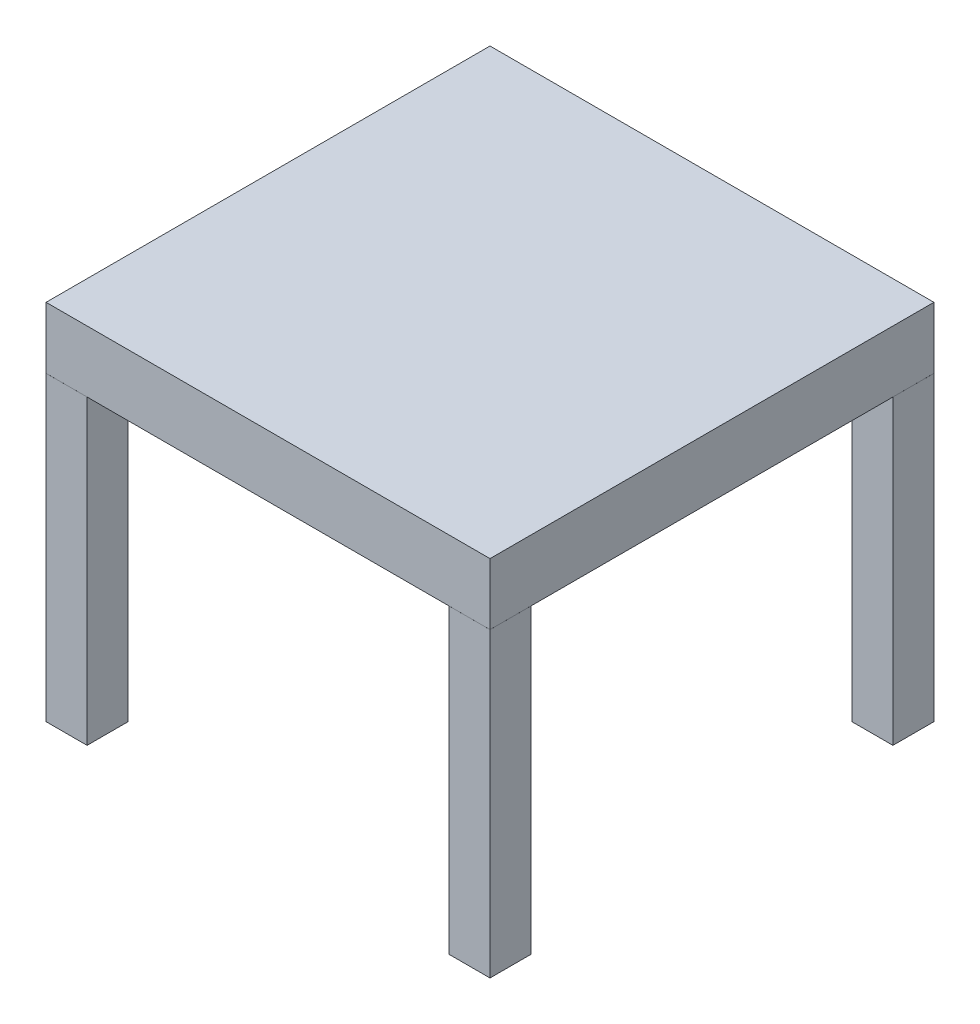
ISO-10303-21;
HEADER;
FILE_DESCRIPTION(('STEP AP214'),'2;1');
FILE_NAME('part.step','',(''),(''),'','','');
FILE_SCHEMA(('AUTOMOTIVE_DESIGN { 1 0 10303 214 1 1 1 1 }'));
ENDSEC;
DATA;
#1=APPLICATION_CONTEXT('core data for automotive mechanical design processes');
#2=APPLICATION_PROTOCOL_DEFINITION('international standard','automotive_design',2000,#1);
#3=PRODUCT_CONTEXT('',#1,'mechanical');
#4=PRODUCT('Part','Part','',(#3));
#5=PRODUCT_RELATED_PRODUCT_CATEGORY('part','',(#4));
#6=PRODUCT_DEFINITION_FORMATION('','',#4);
#7=PRODUCT_DEFINITION_CONTEXT('part definition',#1,'design');
#8=PRODUCT_DEFINITION('design','',#6,#7);
#9=PRODUCT_DEFINITION_SHAPE('','',#8);
#10=(LENGTH_UNIT() NAMED_UNIT(*) SI_UNIT(.MILLI.,.METRE.));
#11=(NAMED_UNIT(*) PLANE_ANGLE_UNIT() SI_UNIT($,.RADIAN.));
#12=(NAMED_UNIT(*) SI_UNIT($,.STERADIAN.) SOLID_ANGLE_UNIT());
#13=UNCERTAINTY_MEASURE_WITH_UNIT(LENGTH_MEASURE(1.E-05),#10,'distance_accuracy_value','');
#14=(GEOMETRIC_REPRESENTATION_CONTEXT(3) GLOBAL_UNCERTAINTY_ASSIGNED_CONTEXT((#13)) GLOBAL_UNIT_ASSIGNED_CONTEXT((#10,
#11,#12)) REPRESENTATION_CONTEXT('',''));
#15=CARTESIAN_POINT('',(0.,0.,0.));
#16=DIRECTION('',(0.,0.,1.));
#17=DIRECTION('',(1.,0.,0.));
#18=AXIS2_PLACEMENT_3D('',#15,#16,#17);
#19=CARTESIAN_POINT('',(-275.,38.1,-275.));
#20=DIRECTION('',(1.,0.,0.));
#21=DIRECTION('',(0.,0.,-1.));
#22=AXIS2_PLACEMENT_3D('',#19,#20,#21);
#23=PLANE('',#22);
#24=DIRECTION('',(0.,-1.,0.));
#25=VECTOR('',#24,1.);
#26=CARTESIAN_POINT('',(-275.,38.1,-275.));
#27=LINE('',#26,#25);
#28=CARTESIAN_POINT('',(-275.,38.1,-275.));
#29=VERTEX_POINT('',#28);
#30=CARTESIAN_POINT('',(-275.,-38.1,-275.));
#31=VERTEX_POINT('',#30);
#32=EDGE_CURVE('E115',#29,#31,#27,.T.);
#33=ORIENTED_EDGE('',*,*,#32,.T.);
#34=DIRECTION('',(0.,0.,1.));
#35=VECTOR('',#34,1.);
#36=CARTESIAN_POINT('',(-275.,-38.1,295.148496587345));
#37=LINE('',#36,#35);
#38=CARTESIAN_POINT('',(-275.,-38.1,275.));
#39=VERTEX_POINT('',#38);
#40=EDGE_CURVE('E85',#31,#39,#37,.T.);
#41=ORIENTED_EDGE('',*,*,#40,.T.);
#42=DIRECTION('',(0.,-1.,0.));
#43=VECTOR('',#42,1.);
#44=CARTESIAN_POINT('',(-275.,38.1,275.));
#45=LINE('',#44,#43);
#46=CARTESIAN_POINT('',(-275.,38.1,275.));
#47=VERTEX_POINT('',#46);
#48=EDGE_CURVE('E55',#47,#39,#45,.T.);
#49=ORIENTED_EDGE('',*,*,#48,.F.);
#50=DIRECTION('',(0.,0.,1.));
#51=VECTOR('',#50,1.);
#52=CARTESIAN_POINT('',(-275.,38.1,-275.));
#53=LINE('',#52,#51);
#54=EDGE_CURVE('E104',#29,#47,#53,.T.);
#55=ORIENTED_EDGE('',*,*,#54,.F.);
#56=EDGE_LOOP('',(#33,#41,#49,#55));
#57=FACE_BOUND('',#56,.T.);
#58=ADVANCED_FACE('F52',(#57),#23,.F.);
#59=CARTESIAN_POINT('',(-275.,38.1,275.));
#60=DIRECTION('',(0.,0.,-1.));
#61=DIRECTION('',(-1.,0.,0.));
#62=AXIS2_PLACEMENT_3D('',#59,#60,#61);
#63=PLANE('',#62);
#64=ORIENTED_EDGE('',*,*,#48,.T.);
#65=DIRECTION('',(1.,0.,0.));
#66=VECTOR('',#65,1.);
#67=CARTESIAN_POINT('',(-275.,-38.1,275.));
#68=LINE('',#67,#66);
#69=CARTESIAN_POINT('',(275.,-38.1,275.));
#70=VERTEX_POINT('',#69);
#71=EDGE_CURVE('E71',#39,#70,#68,.T.);
#72=ORIENTED_EDGE('',*,*,#71,.T.);
#73=DIRECTION('',(0.,-1.,0.));
#74=VECTOR('',#73,1.);
#75=CARTESIAN_POINT('',(275.,38.1,275.));
#76=LINE('',#75,#74);
#77=CARTESIAN_POINT('',(275.,38.1,275.));
#78=VERTEX_POINT('',#77);
#79=EDGE_CURVE('E101',#78,#70,#76,.T.);
#80=ORIENTED_EDGE('',*,*,#79,.F.);
#81=DIRECTION('',(1.,0.,0.));
#82=VECTOR('',#81,1.);
#83=CARTESIAN_POINT('',(-275.,38.1,275.));
#84=LINE('',#83,#82);
#85=EDGE_CURVE('E98',#47,#78,#84,.T.);
#86=ORIENTED_EDGE('',*,*,#85,.F.);
#87=EDGE_LOOP('',(#64,#72,#80,#86));
#88=FACE_BOUND('',#87,.T.);
#89=ADVANCED_FACE('F99',(#88),#63,.F.);
#90=CARTESIAN_POINT('',(275.,38.1,-275.));
#91=DIRECTION('',(-1.,0.,0.));
#92=DIRECTION('',(0.,0.,1.));
#93=AXIS2_PLACEMENT_3D('',#90,#91,#92);
#94=PLANE('',#93);
#95=ORIENTED_EDGE('',*,*,#79,.T.);
#96=DIRECTION('',(0.,0.,-1.));
#97=VECTOR('',#96,1.);
#98=CARTESIAN_POINT('',(275.,-38.1,-275.));
#99=LINE('',#98,#97);
#100=CARTESIAN_POINT('',(275.,-38.1,-275.));
#101=VERTEX_POINT('',#100);
#102=EDGE_CURVE('E122',#70,#101,#99,.T.);
#103=ORIENTED_EDGE('',*,*,#102,.T.);
#104=DIRECTION('',(0.,-1.,0.));
#105=VECTOR('',#104,1.);
#106=CARTESIAN_POINT('',(275.,38.1,-275.));
#107=LINE('',#106,#105);
#108=CARTESIAN_POINT('',(275.,38.1,-275.));
#109=VERTEX_POINT('',#108);
#110=EDGE_CURVE('E123',#109,#101,#107,.T.);
#111=ORIENTED_EDGE('',*,*,#110,.F.);
#112=DIRECTION('',(0.,0.,-1.));
#113=VECTOR('',#112,1.);
#114=CARTESIAN_POINT('',(275.,38.1,-275.));
#115=LINE('',#114,#113);
#116=EDGE_CURVE('E62',#78,#109,#115,.T.);
#117=ORIENTED_EDGE('',*,*,#116,.F.);
#118=EDGE_LOOP('',(#95,#103,#111,#117));
#119=FACE_BOUND('',#118,.T.);
#120=ADVANCED_FACE('F135',(#119),#94,.F.);
#121=CARTESIAN_POINT('',(-275.,38.1,-275.));
#122=DIRECTION('',(0.,0.,1.));
#123=DIRECTION('',(1.,0.,0.));
#124=AXIS2_PLACEMENT_3D('',#121,#122,#123);
#125=PLANE('',#124);
#126=ORIENTED_EDGE('',*,*,#110,.T.);
#127=DIRECTION('',(-1.,0.,0.));
#128=VECTOR('',#127,1.);
#129=CARTESIAN_POINT('',(-275.,-38.1,-275.));
#130=LINE('',#129,#128);
#131=EDGE_CURVE('E109',#101,#31,#130,.T.);
#132=ORIENTED_EDGE('',*,*,#131,.T.);
#133=ORIENTED_EDGE('',*,*,#32,.F.);
#134=DIRECTION('',(-1.,0.,0.));
#135=VECTOR('',#134,1.);
#136=CARTESIAN_POINT('',(-275.,38.1,-275.));
#137=LINE('',#136,#135);
#138=EDGE_CURVE('E12',#109,#29,#137,.T.);
#139=ORIENTED_EDGE('',*,*,#138,.F.);
#140=EDGE_LOOP('',(#126,#132,#133,#139));
#141=FACE_BOUND('',#140,.T.);
#142=ADVANCED_FACE('F136',(#141),#125,.F.);
#143=CARTESIAN_POINT('',(0.,-38.1,0.));
#144=DIRECTION('',(0.,1.,0.));
#145=DIRECTION('',(0.,0.,1.));
#146=AXIS2_PLACEMENT_3D('',#143,#144,#145);
#147=PLANE('',#146);
#148=ORIENTED_EDGE('',*,*,#131,.F.);
#149=ORIENTED_EDGE('',*,*,#102,.F.);
#150=ORIENTED_EDGE('',*,*,#71,.F.);
#151=ORIENTED_EDGE('',*,*,#40,.F.);
#152=EDGE_LOOP('',(#148,#149,#150,#151));
#153=FACE_BOUND('',#152,.T.);
#154=ADVANCED_FACE('F138',(#153),#147,.F.);
#155=CARTESIAN_POINT('',(0.,38.1,0.));
#156=DIRECTION('',(0.,1.,0.));
#157=DIRECTION('',(0.,0.,1.));
#158=AXIS2_PLACEMENT_3D('',#155,#156,#157);
#159=PLANE('',#158);
#160=ORIENTED_EDGE('',*,*,#54,.T.);
#161=ORIENTED_EDGE('',*,*,#85,.T.);
#162=ORIENTED_EDGE('',*,*,#116,.T.);
#163=ORIENTED_EDGE('',*,*,#138,.T.);
#164=EDGE_LOOP('',(#160,#161,#162,#163));
#165=FACE_BOUND('',#164,.T.);
#166=ADVANCED_FACE('F107',(#165),#159,.T.);
#167=CLOSED_SHELL('',(#58,#89,#120,#142,#154,#166));
#168=MANIFOLD_SOLID_BREP('B2',#167);
#169=CARTESIAN_POINT('',(0.,-411.9,0.));
#170=DIRECTION('',(0.,1.,0.));
#171=DIRECTION('',(0.,0.,1.));
#172=AXIS2_PLACEMENT_3D('',#169,#170,#171);
#173=PLANE('',#172);
#174=DIRECTION('',(0.,0.,1.));
#175=VECTOR('',#174,1.);
#176=CARTESIAN_POINT('',(-275.,-411.9,275.));
#177=LINE('',#176,#175);
#178=CARTESIAN_POINT('',(-275.,-411.9,224.2));
#179=VERTEX_POINT('',#178);
#180=CARTESIAN_POINT('',(-275.,-411.9,275.));
#181=VERTEX_POINT('',#180);
#182=EDGE_CURVE('E50',#179,#181,#177,.T.);
#183=ORIENTED_EDGE('',*,*,#182,.F.);
#184=DIRECTION('',(-1.,0.,0.));
#185=VECTOR('',#184,1.);
#186=CARTESIAN_POINT('',(-275.,-411.9,224.2));
#187=LINE('',#186,#185);
#188=CARTESIAN_POINT('',(-224.2,-411.9,224.2));
#189=VERTEX_POINT('',#188);
#190=EDGE_CURVE('E271',#189,#179,#187,.T.);
#191=ORIENTED_EDGE('',*,*,#190,.F.);
#192=DIRECTION('',(0.,0.,-1.));
#193=VECTOR('',#192,1.);
#194=CARTESIAN_POINT('',(-224.2,-411.9,275.));
#195=LINE('',#194,#193);
#196=CARTESIAN_POINT('',(-224.2,-411.9,275.));
#197=VERTEX_POINT('',#196);
#198=EDGE_CURVE('E268',#197,#189,#195,.T.);
#199=ORIENTED_EDGE('',*,*,#198,.F.);
#200=DIRECTION('',(1.,0.,0.));
#201=VECTOR('',#200,1.);
#202=CARTESIAN_POINT('',(-275.,-411.9,275.));
#203=LINE('',#202,#201);
#204=EDGE_CURVE('E293',#181,#197,#203,.T.);
#205=ORIENTED_EDGE('',*,*,#204,.F.);
#206=EDGE_LOOP('',(#183,#191,#199,#205));
#207=FACE_BOUND('',#206,.T.);
#208=ADVANCED_FACE('F225',(#207),#173,.F.);
#209=CARTESIAN_POINT('',(-275.,-933.742048968553,224.2));
#210=DIRECTION('',(0.,0.,1.));
#211=DIRECTION('',(1.,0.,0.));
#212=AXIS2_PLACEMENT_3D('',#209,#210,#211);
#213=PLANE('',#212);
#214=DIRECTION('',(0.,1.,0.));
#215=VECTOR('',#214,1.);
#216=CARTESIAN_POINT('',(-275.,-933.742048968553,224.2));
#217=LINE('',#216,#215);
#218=CARTESIAN_POINT('',(-275.,-38.1254,224.2));
#219=VERTEX_POINT('',#218);
#220=EDGE_CURVE('E291',#179,#219,#217,.T.);
#221=ORIENTED_EDGE('',*,*,#220,.T.);
#222=DIRECTION('',(1.,0.,0.));
#223=VECTOR('',#222,1.);
#224=CARTESIAN_POINT('',(-275.,-38.1254,224.2));
#225=LINE('',#224,#223);
#226=CARTESIAN_POINT('',(-224.2,-38.1254,224.2));
#227=VERTEX_POINT('',#226);
#228=EDGE_CURVE('E252',#219,#227,#225,.T.);
#229=ORIENTED_EDGE('',*,*,#228,.T.);
#230=DIRECTION('',(0.,1.,0.));
#231=VECTOR('',#230,1.);
#232=CARTESIAN_POINT('',(-224.2,-933.742048968553,224.2));
#233=LINE('',#232,#231);
#234=EDGE_CURVE('E276',#189,#227,#233,.T.);
#235=ORIENTED_EDGE('',*,*,#234,.F.);
#236=ORIENTED_EDGE('',*,*,#190,.T.);
#237=EDGE_LOOP('',(#221,#229,#235,#236));
#238=FACE_BOUND('',#237,.T.);
#239=ADVANCED_FACE('F279',(#238),#213,.F.);
#240=CARTESIAN_POINT('',(-224.2,-933.742048968553,275.));
#241=DIRECTION('',(-1.,0.,0.));
#242=DIRECTION('',(0.,0.,1.));
#243=AXIS2_PLACEMENT_3D('',#240,#241,#242);
#244=PLANE('',#243);
#245=ORIENTED_EDGE('',*,*,#234,.T.);
#246=DIRECTION('',(0.,0.,1.));
#247=VECTOR('',#246,1.);
#248=CARTESIAN_POINT('',(-224.2,-38.1254,275.));
#249=LINE('',#248,#247);
#250=CARTESIAN_POINT('',(-224.2,-38.1254,275.));
#251=VERTEX_POINT('',#250);
#252=EDGE_CURVE('E256',#227,#251,#249,.T.);
#253=ORIENTED_EDGE('',*,*,#252,.T.);
#254=DIRECTION('',(0.,1.,0.));
#255=VECTOR('',#254,1.);
#256=CARTESIAN_POINT('',(-224.2,-933.742048968553,275.));
#257=LINE('',#256,#255);
#258=EDGE_CURVE('E285',#197,#251,#257,.T.);
#259=ORIENTED_EDGE('',*,*,#258,.F.);
#260=ORIENTED_EDGE('',*,*,#198,.T.);
#261=EDGE_LOOP('',(#245,#253,#259,#260));
#262=FACE_BOUND('',#261,.T.);
#263=ADVANCED_FACE('F283',(#262),#244,.F.);
#264=CARTESIAN_POINT('',(-275.,38.1,275.));
#265=DIRECTION('',(0.,0.,-1.));
#266=DIRECTION('',(-1.,0.,0.));
#267=AXIS2_PLACEMENT_3D('',#264,#265,#266);
#268=PLANE('',#267);
#269=ORIENTED_EDGE('',*,*,#258,.T.);
#270=DIRECTION('',(-1.,0.,0.));
#271=VECTOR('',#270,1.);
#272=CARTESIAN_POINT('',(-275.,-38.1254,275.));
#273=LINE('',#272,#271);
#274=CARTESIAN_POINT('',(-275.,-38.1254,275.));
#275=VERTEX_POINT('',#274);
#276=EDGE_CURVE('E243',#251,#275,#273,.T.);
#277=ORIENTED_EDGE('',*,*,#276,.T.);
#278=DIRECTION('',(0.,-1.,0.));
#279=VECTOR('',#278,1.);
#280=CARTESIAN_POINT('',(-275.,38.1,275.));
#281=LINE('',#280,#279);
#282=EDGE_CURVE('E229',#275,#181,#281,.T.);
#283=ORIENTED_EDGE('',*,*,#282,.T.);
#284=ORIENTED_EDGE('',*,*,#204,.T.);
#285=EDGE_LOOP('',(#269,#277,#283,#284));
#286=FACE_BOUND('',#285,.T.);
#287=ADVANCED_FACE('F299',(#286),#268,.F.);
#288=CARTESIAN_POINT('',(-275.,38.1,-275.));
#289=DIRECTION('',(1.,0.,0.));
#290=DIRECTION('',(0.,0.,-1.));
#291=AXIS2_PLACEMENT_3D('',#288,#289,#290);
#292=PLANE('',#291);
#293=ORIENTED_EDGE('',*,*,#282,.F.);
#294=DIRECTION('',(0.,0.,-1.));
#295=VECTOR('',#294,1.);
#296=CARTESIAN_POINT('',(-275.,-38.1254,295.148496587345));
#297=LINE('',#296,#295);
#298=EDGE_CURVE('E235',#275,#219,#297,.T.);
#299=ORIENTED_EDGE('',*,*,#298,.T.);
#300=ORIENTED_EDGE('',*,*,#220,.F.);
#301=ORIENTED_EDGE('',*,*,#182,.T.);
#302=EDGE_LOOP('',(#293,#299,#300,#301));
#303=FACE_BOUND('',#302,.T.);
#304=ADVANCED_FACE('F227',(#303),#292,.F.);
#305=CARTESIAN_POINT('',(-275.,-38.1254,295.148496587345));
#306=DIRECTION('',(0.,-1.,0.));
#307=DIRECTION('',(0.,0.,-1.));
#308=AXIS2_PLACEMENT_3D('',#305,#306,#307);
#309=PLANE('',#308);
#310=ORIENTED_EDGE('',*,*,#252,.F.);
#311=ORIENTED_EDGE('',*,*,#228,.F.);
#312=ORIENTED_EDGE('',*,*,#298,.F.);
#313=ORIENTED_EDGE('',*,*,#276,.F.);
#314=EDGE_LOOP('',(#310,#311,#312,#313));
#315=FACE_BOUND('',#314,.T.);
#316=ADVANCED_FACE('F297',(#315),#309,.F.);
#317=CLOSED_SHELL('',(#208,#239,#263,#287,#304,#316));
#318=MANIFOLD_SOLID_BREP('B6',#317);
#319=CARTESIAN_POINT('',(0.,-411.9,0.));
#320=DIRECTION('',(0.,1.,0.));
#321=DIRECTION('',(0.,0.,1.));
#322=AXIS2_PLACEMENT_3D('',#319,#320,#321);
#323=PLANE('',#322);
#324=DIRECTION('',(-1.,0.,0.));
#325=VECTOR('',#324,1.);
#326=CARTESIAN_POINT('',(-275.,-411.9,-275.));
#327=LINE('',#326,#325);
#328=CARTESIAN_POINT('',(-224.2,-411.9,-275.));
#329=VERTEX_POINT('',#328);
#330=CARTESIAN_POINT('',(-275.,-411.9,-275.));
#331=VERTEX_POINT('',#330);
#332=EDGE_CURVE('E426',#329,#331,#327,.T.);
#333=ORIENTED_EDGE('',*,*,#332,.F.);
#334=DIRECTION('',(0.,0.,-1.));
#335=VECTOR('',#334,1.);
#336=CARTESIAN_POINT('',(-224.2,-411.9,-275.));
#337=LINE('',#336,#335);
#338=CARTESIAN_POINT('',(-224.2,-411.9,-224.2));
#339=VERTEX_POINT('',#338);
#340=EDGE_CURVE('E433',#339,#329,#337,.T.);
#341=ORIENTED_EDGE('',*,*,#340,.F.);
#342=DIRECTION('',(1.,0.,0.));
#343=VECTOR('',#342,1.);
#344=CARTESIAN_POINT('',(-275.,-411.9,-224.2));
#345=LINE('',#344,#343);
#346=CARTESIAN_POINT('',(-275.,-411.9,-224.2));
#347=VERTEX_POINT('',#346);
#348=EDGE_CURVE('E422',#347,#339,#345,.T.);
#349=ORIENTED_EDGE('',*,*,#348,.F.);
#350=DIRECTION('',(0.,0.,1.));
#351=VECTOR('',#350,1.);
#352=CARTESIAN_POINT('',(-275.,-411.9,-275.));
#353=LINE('',#352,#351);
#354=EDGE_CURVE('E223',#331,#347,#353,.T.);
#355=ORIENTED_EDGE('',*,*,#354,.F.);
#356=EDGE_LOOP('',(#333,#341,#349,#355));
#357=FACE_BOUND('',#356,.T.);
#358=ADVANCED_FACE('F371',(#357),#323,.F.);
#359=CARTESIAN_POINT('',(-224.2,-933.742048968553,-275.));
#360=DIRECTION('',(-1.,0.,0.));
#361=DIRECTION('',(0.,0.,1.));
#362=AXIS2_PLACEMENT_3D('',#359,#360,#361);
#363=PLANE('',#362);
#364=DIRECTION('',(0.,1.,0.));
#365=VECTOR('',#364,1.);
#366=CARTESIAN_POINT('',(-224.2,-933.742048968553,-275.));
#367=LINE('',#366,#365);
#368=CARTESIAN_POINT('',(-224.2,-38.1254,-275.));
#369=VERTEX_POINT('',#368);
#370=EDGE_CURVE('E437',#329,#369,#367,.T.);
#371=ORIENTED_EDGE('',*,*,#370,.T.);
#372=DIRECTION('',(0.,0.,1.));
#373=VECTOR('',#372,1.);
#374=CARTESIAN_POINT('',(-224.2,-38.1254,-275.));
#375=LINE('',#374,#373);
#376=CARTESIAN_POINT('',(-224.2,-38.1254,-224.2));
#377=VERTEX_POINT('',#376);
#378=EDGE_CURVE('E435',#369,#377,#375,.T.);
#379=ORIENTED_EDGE('',*,*,#378,.T.);
#380=DIRECTION('',(0.,1.,0.));
#381=VECTOR('',#380,1.);
#382=CARTESIAN_POINT('',(-224.2,-933.742048968553,-224.2));
#383=LINE('',#382,#381);
#384=EDGE_CURVE('E421',#339,#377,#383,.T.);
#385=ORIENTED_EDGE('',*,*,#384,.F.);
#386=ORIENTED_EDGE('',*,*,#340,.T.);
#387=EDGE_LOOP('',(#371,#379,#385,#386));
#388=FACE_BOUND('',#387,.T.);
#389=ADVANCED_FACE('F443',(#388),#363,.F.);
#390=CARTESIAN_POINT('',(-275.,-933.742048968553,-224.2));
#391=DIRECTION('',(0.,0.,-1.));
#392=DIRECTION('',(-1.,0.,0.));
#393=AXIS2_PLACEMENT_3D('',#390,#391,#392);
#394=PLANE('',#393);
#395=ORIENTED_EDGE('',*,*,#384,.T.);
#396=DIRECTION('',(-1.,0.,0.));
#397=VECTOR('',#396,1.);
#398=CARTESIAN_POINT('',(-275.,-38.1254,-224.2));
#399=LINE('',#398,#397);
#400=CARTESIAN_POINT('',(-275.,-38.1254,-224.2));
#401=VERTEX_POINT('',#400);
#402=EDGE_CURVE('E407',#377,#401,#399,.T.);
#403=ORIENTED_EDGE('',*,*,#402,.T.);
#404=DIRECTION('',(0.,1.,0.));
#405=VECTOR('',#404,1.);
#406=CARTESIAN_POINT('',(-275.,-933.742048968553,-224.2));
#407=LINE('',#406,#405);
#408=EDGE_CURVE('E413',#347,#401,#407,.T.);
#409=ORIENTED_EDGE('',*,*,#408,.F.);
#410=ORIENTED_EDGE('',*,*,#348,.T.);
#411=EDGE_LOOP('',(#395,#403,#409,#410));
#412=FACE_BOUND('',#411,.T.);
#413=ADVANCED_FACE('F418',(#412),#394,.F.);
#414=CARTESIAN_POINT('',(-275.,38.1,-275.));
#415=DIRECTION('',(0.,0.,1.));
#416=DIRECTION('',(1.,0.,0.));
#417=AXIS2_PLACEMENT_3D('',#414,#415,#416);
#418=PLANE('',#417);
#419=DIRECTION('',(0.,-1.,0.));
#420=VECTOR('',#419,1.);
#421=CARTESIAN_POINT('',(-275.,38.1,-275.));
#422=LINE('',#421,#420);
#423=CARTESIAN_POINT('',(-275.,-38.1254,-275.));
#424=VERTEX_POINT('',#423);
#425=EDGE_CURVE('E375',#424,#331,#422,.T.);
#426=ORIENTED_EDGE('',*,*,#425,.F.);
#427=DIRECTION('',(1.,0.,0.));
#428=VECTOR('',#427,1.);
#429=CARTESIAN_POINT('',(-275.,-38.1254,-275.));
#430=LINE('',#429,#428);
#431=EDGE_CURVE('E388',#424,#369,#430,.T.);
#432=ORIENTED_EDGE('',*,*,#431,.T.);
#433=ORIENTED_EDGE('',*,*,#370,.F.);
#434=ORIENTED_EDGE('',*,*,#332,.T.);
#435=EDGE_LOOP('',(#426,#432,#433,#434));
#436=FACE_BOUND('',#435,.T.);
#437=ADVANCED_FACE('F444',(#436),#418,.F.);
#438=CARTESIAN_POINT('',(-275.,38.1,-275.));
#439=DIRECTION('',(1.,0.,0.));
#440=DIRECTION('',(0.,0.,-1.));
#441=AXIS2_PLACEMENT_3D('',#438,#439,#440);
#442=PLANE('',#441);
#443=ORIENTED_EDGE('',*,*,#408,.T.);
#444=DIRECTION('',(0.,0.,-1.));
#445=VECTOR('',#444,1.);
#446=CARTESIAN_POINT('',(-275.,-38.1254,295.148496587345));
#447=LINE('',#446,#445);
#448=EDGE_CURVE('E409',#401,#424,#447,.T.);
#449=ORIENTED_EDGE('',*,*,#448,.T.);
#450=ORIENTED_EDGE('',*,*,#425,.T.);
#451=ORIENTED_EDGE('',*,*,#354,.T.);
#452=EDGE_LOOP('',(#443,#449,#450,#451));
#453=FACE_BOUND('',#452,.T.);
#454=ADVANCED_FACE('F424',(#453),#442,.F.);
#455=CARTESIAN_POINT('',(-275.,-38.1254,295.148496587345));
#456=DIRECTION('',(0.,-1.,0.));
#457=DIRECTION('',(0.,0.,-1.));
#458=AXIS2_PLACEMENT_3D('',#455,#456,#457);
#459=PLANE('',#458);
#460=ORIENTED_EDGE('',*,*,#448,.F.);
#461=ORIENTED_EDGE('',*,*,#402,.F.);
#462=ORIENTED_EDGE('',*,*,#378,.F.);
#463=ORIENTED_EDGE('',*,*,#431,.F.);
#464=EDGE_LOOP('',(#460,#461,#462,#463));
#465=FACE_BOUND('',#464,.T.);
#466=ADVANCED_FACE('F373',(#465),#459,.F.);
#467=CLOSED_SHELL('',(#358,#389,#413,#437,#454,#466));
#468=MANIFOLD_SOLID_BREP('B44',#467);
#469=CARTESIAN_POINT('',(0.,-411.9,0.));
#470=DIRECTION('',(0.,1.,0.));
#471=DIRECTION('',(0.,0.,1.));
#472=AXIS2_PLACEMENT_3D('',#469,#470,#471);
#473=PLANE('',#472);
#474=DIRECTION('',(0.,0.,-1.));
#475=VECTOR('',#474,1.);
#476=CARTESIAN_POINT('',(275.,-411.9,-275.));
#477=LINE('',#476,#475);
#478=CARTESIAN_POINT('',(275.,-411.9,-224.2));
#479=VERTEX_POINT('',#478);
#480=CARTESIAN_POINT('',(275.,-411.9,-275.));
#481=VERTEX_POINT('',#480);
#482=EDGE_CURVE('E369',#479,#481,#477,.T.);
#483=ORIENTED_EDGE('',*,*,#482,.F.);
#484=DIRECTION('',(1.,0.,0.));
#485=VECTOR('',#484,1.);
#486=CARTESIAN_POINT('',(275.,-411.9,-224.2));
#487=LINE('',#486,#485);
#488=CARTESIAN_POINT('',(224.2,-411.9,-224.2));
#489=VERTEX_POINT('',#488);
#490=EDGE_CURVE('E561',#489,#479,#487,.T.);
#491=ORIENTED_EDGE('',*,*,#490,.F.);
#492=DIRECTION('',(0.,0.,1.));
#493=VECTOR('',#492,1.);
#494=CARTESIAN_POINT('',(224.2,-411.9,-275.));
#495=LINE('',#494,#493);
#496=CARTESIAN_POINT('',(224.2,-411.9,-275.));
#497=VERTEX_POINT('',#496);
#498=EDGE_CURVE('E564',#497,#489,#495,.T.);
#499=ORIENTED_EDGE('',*,*,#498,.F.);
#500=DIRECTION('',(-1.,0.,0.));
#501=VECTOR('',#500,1.);
#502=CARTESIAN_POINT('',(275.,-411.9,-275.));
#503=LINE('',#502,#501);
#504=EDGE_CURVE('E586',#481,#497,#503,.T.);
#505=ORIENTED_EDGE('',*,*,#504,.F.);
#506=EDGE_LOOP('',(#483,#491,#499,#505));
#507=FACE_BOUND('',#506,.T.);
#508=ADVANCED_FACE('F517',(#507),#473,.F.);
#509=CARTESIAN_POINT('',(275.,-933.742048968553,-224.2));
#510=DIRECTION('',(0.,0.,-1.));
#511=DIRECTION('',(-1.,0.,0.));
#512=AXIS2_PLACEMENT_3D('',#509,#510,#511);
#513=PLANE('',#512);
#514=DIRECTION('',(0.,1.,0.));
#515=VECTOR('',#514,1.);
#516=CARTESIAN_POINT('',(275.,-933.742048968553,-224.2));
#517=LINE('',#516,#515);
#518=CARTESIAN_POINT('',(275.,-38.1254,-224.2));
#519=VERTEX_POINT('',#518);
#520=EDGE_CURVE('E584',#479,#519,#517,.T.);
#521=ORIENTED_EDGE('',*,*,#520,.T.);
#522=DIRECTION('',(-1.,0.,0.));
#523=VECTOR('',#522,1.);
#524=CARTESIAN_POINT('',(275.,-38.1254,-224.2));
#525=LINE('',#524,#523);
#526=CARTESIAN_POINT('',(224.2,-38.1254,-224.2));
#527=VERTEX_POINT('',#526);
#528=EDGE_CURVE('E568',#519,#527,#525,.T.);
#529=ORIENTED_EDGE('',*,*,#528,.T.);
#530=DIRECTION('',(0.,1.,0.));
#531=VECTOR('',#530,1.);
#532=CARTESIAN_POINT('',(224.2,-933.742048968553,-224.2));
#533=LINE('',#532,#531);
#534=EDGE_CURVE('E567',#489,#527,#533,.T.);
#535=ORIENTED_EDGE('',*,*,#534,.F.);
#536=ORIENTED_EDGE('',*,*,#490,.T.);
#537=EDGE_LOOP('',(#521,#529,#535,#536));
#538=FACE_BOUND('',#537,.T.);
#539=ADVANCED_FACE('F572',(#538),#513,.F.);
#540=CARTESIAN_POINT('',(224.2,-933.742048968553,-275.));
#541=DIRECTION('',(1.,0.,0.));
#542=DIRECTION('',(0.,0.,-1.));
#543=AXIS2_PLACEMENT_3D('',#540,#541,#542);
#544=PLANE('',#543);
#545=ORIENTED_EDGE('',*,*,#534,.T.);
#546=DIRECTION('',(0.,0.,-1.));
#547=VECTOR('',#546,1.);
#548=CARTESIAN_POINT('',(224.2,-38.1254,-275.));
#549=LINE('',#548,#547);
#550=CARTESIAN_POINT('',(224.2,-38.1254,-275.));
#551=VERTEX_POINT('',#550);
#552=EDGE_CURVE('E574',#527,#551,#549,.T.);
#553=ORIENTED_EDGE('',*,*,#552,.T.);
#554=DIRECTION('',(0.,1.,0.));
#555=VECTOR('',#554,1.);
#556=CARTESIAN_POINT('',(224.2,-933.742048968553,-275.));
#557=LINE('',#556,#555);
#558=EDGE_CURVE('E579',#497,#551,#557,.T.);
#559=ORIENTED_EDGE('',*,*,#558,.F.);
#560=ORIENTED_EDGE('',*,*,#498,.T.);
#561=EDGE_LOOP('',(#545,#553,#559,#560));
#562=FACE_BOUND('',#561,.T.);
#563=ADVANCED_FACE('F577',(#562),#544,.F.);
#564=CARTESIAN_POINT('',(-275.,38.1,-275.));
#565=DIRECTION('',(0.,0.,1.));
#566=DIRECTION('',(1.,0.,0.));
#567=AXIS2_PLACEMENT_3D('',#564,#565,#566);
#568=PLANE('',#567);
#569=ORIENTED_EDGE('',*,*,#558,.T.);
#570=DIRECTION('',(1.,0.,0.));
#571=VECTOR('',#570,1.);
#572=CARTESIAN_POINT('',(-275.,-38.1254,-275.));
#573=LINE('',#572,#571);
#574=CARTESIAN_POINT('',(275.,-38.1254,-275.));
#575=VERTEX_POINT('',#574);
#576=EDGE_CURVE('E521',#551,#575,#573,.T.);
#577=ORIENTED_EDGE('',*,*,#576,.T.);
#578=DIRECTION('',(0.,-1.,0.));
#579=VECTOR('',#578,1.);
#580=CARTESIAN_POINT('',(275.,38.1,-275.));
#581=LINE('',#580,#579);
#582=EDGE_CURVE('E550',#575,#481,#581,.T.);
#583=ORIENTED_EDGE('',*,*,#582,.T.);
#584=ORIENTED_EDGE('',*,*,#504,.T.);
#585=EDGE_LOOP('',(#569,#577,#583,#584));
#586=FACE_BOUND('',#585,.T.);
#587=ADVANCED_FACE('F589',(#586),#568,.F.);
#588=CARTESIAN_POINT('',(275.,38.1,-275.));
#589=DIRECTION('',(-1.,0.,0.));
#590=DIRECTION('',(0.,0.,1.));
#591=AXIS2_PLACEMENT_3D('',#588,#589,#590);
#592=PLANE('',#591);
#593=ORIENTED_EDGE('',*,*,#582,.F.);
#594=DIRECTION('',(0.,0.,1.));
#595=VECTOR('',#594,1.);
#596=CARTESIAN_POINT('',(275.,-38.1254,-275.));
#597=LINE('',#596,#595);
#598=EDGE_CURVE('E527',#575,#519,#597,.T.);
#599=ORIENTED_EDGE('',*,*,#598,.T.);
#600=ORIENTED_EDGE('',*,*,#520,.F.);
#601=ORIENTED_EDGE('',*,*,#482,.T.);
#602=EDGE_LOOP('',(#593,#599,#600,#601));
#603=FACE_BOUND('',#602,.T.);
#604=ADVANCED_FACE('F519',(#603),#592,.F.);
#605=CARTESIAN_POINT('',(-275.,-38.1254,295.148496587345));
#606=DIRECTION('',(0.,-1.,0.));
#607=DIRECTION('',(0.,0.,-1.));
#608=AXIS2_PLACEMENT_3D('',#605,#606,#607);
#609=PLANE('',#608);
#610=ORIENTED_EDGE('',*,*,#576,.F.);
#611=ORIENTED_EDGE('',*,*,#552,.F.);
#612=ORIENTED_EDGE('',*,*,#528,.F.);
#613=ORIENTED_EDGE('',*,*,#598,.F.);
#614=EDGE_LOOP('',(#610,#611,#612,#613));
#615=FACE_BOUND('',#614,.T.);
#616=ADVANCED_FACE('F592',(#615),#609,.F.);
#617=CLOSED_SHELL('',(#508,#539,#563,#587,#604,#616));
#618=MANIFOLD_SOLID_BREP('B217',#617);
#619=CARTESIAN_POINT('',(0.,-411.9,0.));
#620=DIRECTION('',(0.,1.,0.));
#621=DIRECTION('',(0.,0.,1.));
#622=AXIS2_PLACEMENT_3D('',#619,#620,#621);
#623=PLANE('',#622);
#624=DIRECTION('',(1.,0.,0.));
#625=VECTOR('',#624,1.);
#626=CARTESIAN_POINT('',(275.,-411.9,275.));
#627=LINE('',#626,#625);
#628=CARTESIAN_POINT('',(224.2,-411.9,275.));
#629=VERTEX_POINT('',#628);
#630=CARTESIAN_POINT('',(275.,-411.9,275.));
#631=VERTEX_POINT('',#630);
#632=EDGE_CURVE('E677',#629,#631,#627,.T.);
#633=ORIENTED_EDGE('',*,*,#632,.F.);
#634=DIRECTION('',(0.,0.,1.));
#635=VECTOR('',#634,1.);
#636=CARTESIAN_POINT('',(224.2,-411.9,275.));
#637=LINE('',#636,#635);
#638=CARTESIAN_POINT('',(224.2,-411.9,224.2));
#639=VERTEX_POINT('',#638);
#640=EDGE_CURVE('E710',#639,#629,#637,.T.);
#641=ORIENTED_EDGE('',*,*,#640,.F.);
#642=DIRECTION('',(-1.,0.,0.));
#643=VECTOR('',#642,1.);
#644=CARTESIAN_POINT('',(275.,-411.9,224.2));
#645=LINE('',#644,#643);
#646=CARTESIAN_POINT('',(275.,-411.9,224.2));
#647=VERTEX_POINT('',#646);
#648=EDGE_CURVE('E711',#647,#639,#645,.T.);
#649=ORIENTED_EDGE('',*,*,#648,.F.);
#650=DIRECTION('',(0.,0.,-1.));
#651=VECTOR('',#650,1.);
#652=CARTESIAN_POINT('',(275.,-411.9,275.));
#653=LINE('',#652,#651);
#654=EDGE_CURVE('E662',#631,#647,#653,.T.);
#655=ORIENTED_EDGE('',*,*,#654,.F.);
#656=EDGE_LOOP('',(#633,#641,#649,#655));
#657=FACE_BOUND('',#656,.T.);
#658=ADVANCED_FACE('F654',(#657),#623,.F.);
#659=CARTESIAN_POINT('',(224.2,-933.742048968553,275.));
#660=DIRECTION('',(1.,0.,0.));
#661=DIRECTION('',(0.,0.,-1.));
#662=AXIS2_PLACEMENT_3D('',#659,#660,#661);
#663=PLANE('',#662);
#664=DIRECTION('',(0.,1.,0.));
#665=VECTOR('',#664,1.);
#666=CARTESIAN_POINT('',(224.2,-933.742048968553,275.));
#667=LINE('',#666,#665);
#668=CARTESIAN_POINT('',(224.2,-38.1254,275.));
#669=VERTEX_POINT('',#668);
#670=EDGE_CURVE('E704',#629,#669,#667,.T.);
#671=ORIENTED_EDGE('',*,*,#670,.T.);
#672=DIRECTION('',(0.,0.,-1.));
#673=VECTOR('',#672,1.);
#674=CARTESIAN_POINT('',(224.2,-38.1254,275.));
#675=LINE('',#674,#673);
#676=CARTESIAN_POINT('',(224.2,-38.1254,224.2));
#677=VERTEX_POINT('',#676);
#678=EDGE_CURVE('E692',#669,#677,#675,.T.);
#679=ORIENTED_EDGE('',*,*,#678,.T.);
#680=DIRECTION('',(0.,1.,0.));
#681=VECTOR('',#680,1.);
#682=CARTESIAN_POINT('',(224.2,-933.742048968553,224.2));
#683=LINE('',#682,#681);
#684=EDGE_CURVE('E712',#639,#677,#683,.T.);
#685=ORIENTED_EDGE('',*,*,#684,.F.);
#686=ORIENTED_EDGE('',*,*,#640,.T.);
#687=EDGE_LOOP('',(#671,#679,#685,#686));
#688=FACE_BOUND('',#687,.T.);
#689=ADVANCED_FACE('F709',(#688),#663,.F.);
#690=CARTESIAN_POINT('',(275.,-933.742048968553,224.2));
#691=DIRECTION('',(0.,0.,1.));
#692=DIRECTION('',(1.,0.,0.));
#693=AXIS2_PLACEMENT_3D('',#690,#691,#692);
#694=PLANE('',#693);
#695=ORIENTED_EDGE('',*,*,#684,.T.);
#696=DIRECTION('',(1.,0.,0.));
#697=VECTOR('',#696,1.);
#698=CARTESIAN_POINT('',(275.,-38.1254,224.2));
#699=LINE('',#698,#697);
#700=CARTESIAN_POINT('',(275.,-38.1254,224.2));
#701=VERTEX_POINT('',#700);
#702=EDGE_CURVE('E669',#677,#701,#699,.T.);
#703=ORIENTED_EDGE('',*,*,#702,.T.);
#704=DIRECTION('',(0.,1.,0.));
#705=VECTOR('',#704,1.);
#706=CARTESIAN_POINT('',(275.,-933.742048968553,224.2));
#707=LINE('',#706,#705);
#708=EDGE_CURVE('E706',#647,#701,#707,.T.);
#709=ORIENTED_EDGE('',*,*,#708,.F.);
#710=ORIENTED_EDGE('',*,*,#648,.T.);
#711=EDGE_LOOP('',(#695,#703,#709,#710));
#712=FACE_BOUND('',#711,.T.);
#713=ADVANCED_FACE('F728',(#712),#694,.F.);
#714=CARTESIAN_POINT('',(275.,38.1,-275.));
#715=DIRECTION('',(-1.,0.,0.));
#716=DIRECTION('',(0.,0.,1.));
#717=AXIS2_PLACEMENT_3D('',#714,#715,#716);
#718=PLANE('',#717);
#719=ORIENTED_EDGE('',*,*,#708,.T.);
#720=DIRECTION('',(0.,0.,1.));
#721=VECTOR('',#720,1.);
#722=CARTESIAN_POINT('',(275.,-38.1254,-275.));
#723=LINE('',#722,#721);
#724=CARTESIAN_POINT('',(275.,-38.1254,275.));
#725=VERTEX_POINT('',#724);
#726=EDGE_CURVE('E707',#701,#725,#723,.T.);
#727=ORIENTED_EDGE('',*,*,#726,.T.);
#728=DIRECTION('',(0.,-1.,0.));
#729=VECTOR('',#728,1.);
#730=CARTESIAN_POINT('',(275.,38.1,275.));
#731=LINE('',#730,#729);
#732=EDGE_CURVE('E515',#725,#631,#731,.T.);
#733=ORIENTED_EDGE('',*,*,#732,.T.);
#734=ORIENTED_EDGE('',*,*,#654,.T.);
#735=EDGE_LOOP('',(#719,#727,#733,#734));
#736=FACE_BOUND('',#735,.T.);
#737=ADVANCED_FACE('F725',(#736),#718,.F.);
#738=CARTESIAN_POINT('',(-275.,38.1,275.));
#739=DIRECTION('',(0.,0.,-1.));
#740=DIRECTION('',(-1.,0.,0.));
#741=AXIS2_PLACEMENT_3D('',#738,#739,#740);
#742=PLANE('',#741);
#743=ORIENTED_EDGE('',*,*,#732,.F.);
#744=DIRECTION('',(-1.,0.,0.));
#745=VECTOR('',#744,1.);
#746=CARTESIAN_POINT('',(-275.,-38.1254,275.));
#747=LINE('',#746,#745);
#748=EDGE_CURVE('E695',#725,#669,#747,.T.);
#749=ORIENTED_EDGE('',*,*,#748,.T.);
#750=ORIENTED_EDGE('',*,*,#670,.F.);
#751=ORIENTED_EDGE('',*,*,#632,.T.);
#752=EDGE_LOOP('',(#743,#749,#750,#751));
#753=FACE_BOUND('',#752,.T.);
#754=ADVANCED_FACE('F656',(#753),#742,.F.);
#755=CARTESIAN_POINT('',(-275.,-38.1254,295.148496587345));
#756=DIRECTION('',(0.,-1.,0.));
#757=DIRECTION('',(0.,0.,-1.));
#758=AXIS2_PLACEMENT_3D('',#755,#756,#757);
#759=PLANE('',#758);
#760=ORIENTED_EDGE('',*,*,#726,.F.);
#761=ORIENTED_EDGE('',*,*,#702,.F.);
#762=ORIENTED_EDGE('',*,*,#678,.F.);
#763=ORIENTED_EDGE('',*,*,#748,.F.);
#764=EDGE_LOOP('',(#760,#761,#762,#763));
#765=FACE_BOUND('',#764,.T.);
#766=ADVANCED_FACE('F694',(#765),#759,.F.);
#767=CLOSED_SHELL('',(#658,#689,#713,#737,#754,#766));
#768=MANIFOLD_SOLID_BREP('B363',#767);
#769=ADVANCED_BREP_SHAPE_REPRESENTATION('',(#18,#168,#318,#468,#618,#768),#14);
#770=SHAPE_DEFINITION_REPRESENTATION(#9,#769);
ENDSEC;
END-ISO-10303-21;
